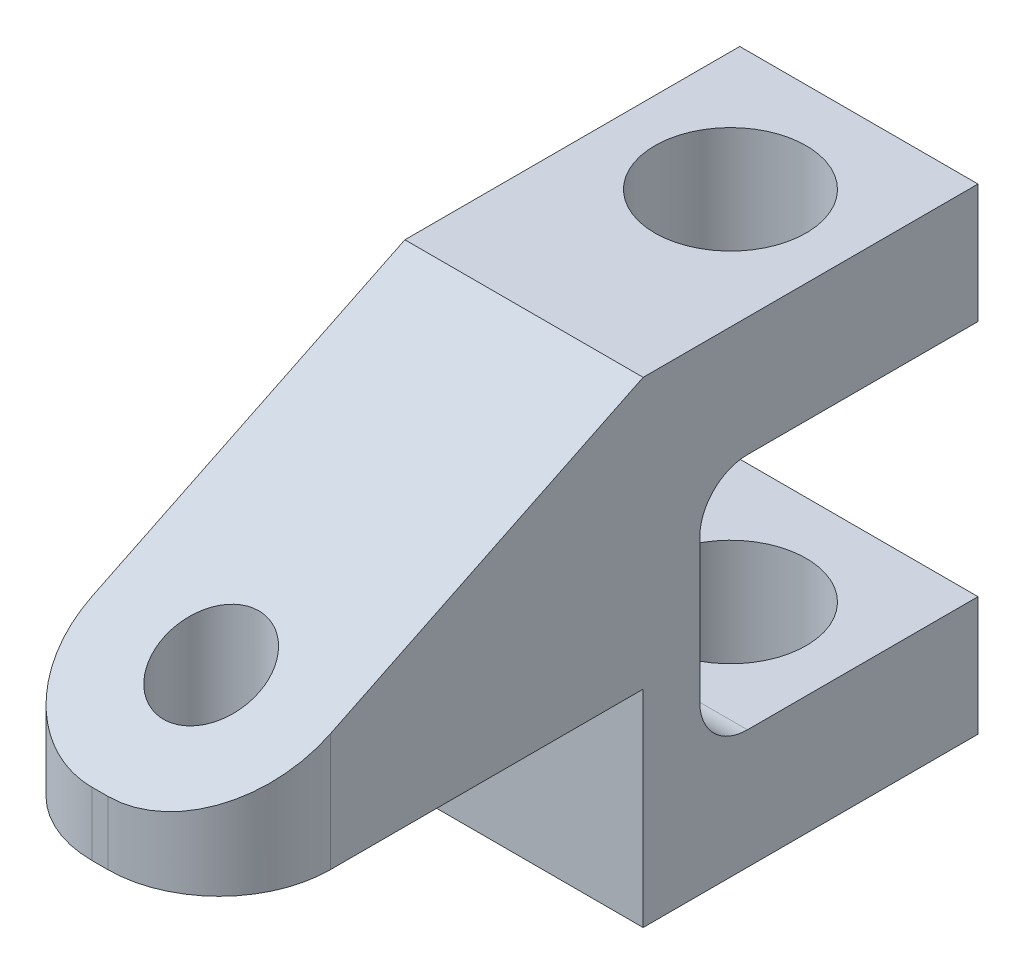
ISO-10303-21;
HEADER;
FILE_DESCRIPTION(('STEP AP214'),'2;1');
FILE_NAME('part.step','',(''),(''),'','','');
FILE_SCHEMA(('AUTOMOTIVE_DESIGN { 1 0 10303 214 1 1 1 1 }'));
ENDSEC;
DATA;
#1=APPLICATION_CONTEXT('core data for automotive mechanical design processes');
#2=APPLICATION_PROTOCOL_DEFINITION('international standard','automotive_design',2000,#1);
#3=PRODUCT_CONTEXT('',#1,'mechanical');
#4=PRODUCT('Part','Part','',(#3));
#5=PRODUCT_RELATED_PRODUCT_CATEGORY('part','',(#4));
#6=PRODUCT_DEFINITION_FORMATION('','',#4);
#7=PRODUCT_DEFINITION_CONTEXT('part definition',#1,'design');
#8=PRODUCT_DEFINITION('design','',#6,#7);
#9=PRODUCT_DEFINITION_SHAPE('','',#8);
#10=(LENGTH_UNIT() NAMED_UNIT(*) SI_UNIT(.MILLI.,.METRE.));
#11=(NAMED_UNIT(*) PLANE_ANGLE_UNIT() SI_UNIT($,.RADIAN.));
#12=(NAMED_UNIT(*) SI_UNIT($,.STERADIAN.) SOLID_ANGLE_UNIT());
#13=UNCERTAINTY_MEASURE_WITH_UNIT(LENGTH_MEASURE(1.E-05),#10,'distance_accuracy_value','');
#14=(GEOMETRIC_REPRESENTATION_CONTEXT(3) GLOBAL_UNCERTAINTY_ASSIGNED_CONTEXT((#13)) GLOBAL_UNIT_ASSIGNED_CONTEXT((#10,
#11,#12)) REPRESENTATION_CONTEXT('',''));
#15=CARTESIAN_POINT('',(0.,0.,0.));
#16=DIRECTION('',(0.,0.,1.));
#17=DIRECTION('',(1.,0.,0.));
#18=AXIS2_PLACEMENT_3D('',#15,#16,#17);
#19=CARTESIAN_POINT('',(-7.5,4.,-23.88888885));
#20=DIRECTION('',(0.,0.,1.));
#21=DIRECTION('',(1.,0.,0.));
#22=AXIS2_PLACEMENT_3D('',#19,#20,#21);
#23=PLANE('',#22);
#24=DIRECTION('',(0.,-1.,0.));
#25=VECTOR('',#24,1.);
#26=CARTESIAN_POINT('',(-7.5,4.,-23.88888885));
#27=LINE('',#26,#25);
#28=CARTESIAN_POINT('',(-7.5,-5.5,-23.88888885));
#29=VERTEX_POINT('',#28);
#30=CARTESIAN_POINT('',(-7.5,-13.,-23.88888885));
#31=VERTEX_POINT('',#30);
#32=EDGE_CURVE('E212',#29,#31,#27,.T.);
#33=ORIENTED_EDGE('',*,*,#32,.F.);
#34=DIRECTION('',(1.,0.,0.));
#35=VECTOR('',#34,1.);
#36=CARTESIAN_POINT('',(-7.5,-5.5,-23.88888885));
#37=LINE('',#36,#35);
#38=CARTESIAN_POINT('',(7.5,-5.5,-23.88888885));
#39=VERTEX_POINT('',#38);
#40=EDGE_CURVE('E172',#29,#39,#37,.T.);
#41=ORIENTED_EDGE('',*,*,#40,.T.);
#42=DIRECTION('',(0.,-1.,0.));
#43=VECTOR('',#42,1.);
#44=CARTESIAN_POINT('',(7.5,4.,-23.88888885));
#45=LINE('',#44,#43);
#46=CARTESIAN_POINT('',(7.5,-13.,-23.88888885));
#47=VERTEX_POINT('',#46);
#48=EDGE_CURVE('E225',#39,#47,#45,.T.);
#49=ORIENTED_EDGE('',*,*,#48,.T.);
#50=DIRECTION('',(-1.,0.,0.));
#51=VECTOR('',#50,1.);
#52=CARTESIAN_POINT('',(-7.5,-13.,-23.88888885));
#53=LINE('',#52,#51);
#54=EDGE_CURVE('E196',#47,#31,#53,.T.);
#55=ORIENTED_EDGE('',*,*,#54,.T.);
#56=EDGE_LOOP('',(#33,#41,#49,#55));
#57=FACE_BOUND('',#56,.T.);
#58=ADVANCED_FACE('F39',(#57),#23,.F.);
#59=CARTESIAN_POINT('',(7.5,4.,23.88888885));
#60=DIRECTION('',(-1.,0.,0.));
#61=DIRECTION('',(0.,0.,1.));
#62=AXIS2_PLACEMENT_3D('',#59,#60,#61);
#63=PLANE('',#62);
#64=DIRECTION('',(0.,-0.437821247110164,0.899062042118841));
#65=VECTOR('',#64,1.);
#66=CARTESIAN_POINT('',(7.5,17.,-2.80649568122188));
#67=LINE('',#66,#65);
#68=CARTESIAN_POINT('',(7.5,17.,-2.80649568122188));
#69=VERTEX_POINT('',#68);
#70=CARTESIAN_POINT('',(7.5,7.40882896418181,16.88888885));
#71=VERTEX_POINT('',#70);
#72=EDGE_CURVE('E156',#69,#71,#67,.T.);
#73=ORIENTED_EDGE('',*,*,#72,.T.);
#74=DIRECTION('',(0.,-1.,0.));
#75=VECTOR('',#74,1.);
#76=CARTESIAN_POINT('',(7.5,4.,16.88888885));
#77=LINE('',#76,#75);
#78=CARTESIAN_POINT('',(7.5,0.,16.88888885));
#79=VERTEX_POINT('',#78);
#80=EDGE_CURVE('E11',#71,#79,#77,.T.);
#81=ORIENTED_EDGE('',*,*,#80,.T.);
#82=DIRECTION('',(0.,0.,-1.));
#83=VECTOR('',#82,1.);
#84=CARTESIAN_POINT('',(7.5,0.,23.88888885));
#85=LINE('',#84,#83);
#86=CARTESIAN_POINT('',(7.5,0.,-2.80649568122187));
#87=VERTEX_POINT('',#86);
#88=EDGE_CURVE('E205',#79,#87,#85,.T.);
#89=ORIENTED_EDGE('',*,*,#88,.T.);
#90=DIRECTION('',(0.,1.,0.));
#91=VECTOR('',#90,1.);
#92=CARTESIAN_POINT('',(7.5,-13.,-2.80649568122188));
#93=LINE('',#92,#91);
#94=CARTESIAN_POINT('',(7.5,-13.,-2.80649568122188));
#95=VERTEX_POINT('',#94);
#96=EDGE_CURVE('E201',#95,#87,#93,.T.);
#97=ORIENTED_EDGE('',*,*,#96,.F.);
#98=DIRECTION('',(0.,0.,-1.));
#99=VECTOR('',#98,1.);
#100=CARTESIAN_POINT('',(7.5,-13.,-23.88888885));
#101=LINE('',#100,#99);
#102=EDGE_CURVE('E192',#95,#47,#101,.T.);
#103=ORIENTED_EDGE('',*,*,#102,.T.);
#104=ORIENTED_EDGE('',*,*,#48,.F.);
#105=DIRECTION('',(0.,0.,-1.));
#106=VECTOR('',#105,1.);
#107=CARTESIAN_POINT('',(7.5,-5.5,-23.88888885));
#108=LINE('',#107,#106);
#109=CARTESIAN_POINT('',(7.5,-5.5,-9.37209962189879));
#110=VERTEX_POINT('',#109);
#111=EDGE_CURVE('E347',#110,#39,#108,.T.);
#112=ORIENTED_EDGE('',*,*,#111,.F.);
#113=CARTESIAN_POINT('',(7.5,-2.5,-9.37209962189879));
#114=DIRECTION('',(-1.,0.,0.));
#115=DIRECTION('',(0.,0.,1.));
#116=AXIS2_PLACEMENT_3D('',#113,#114,#115);
#117=CIRCLE('',#116,3.);
#118=CARTESIAN_POINT('',(7.5,-2.5,-6.37209962189879));
#119=VERTEX_POINT('',#118);
#120=EDGE_CURVE('E254',#110,#119,#117,.T.);
#121=ORIENTED_EDGE('',*,*,#120,.T.);
#122=DIRECTION('',(0.,-1.,0.));
#123=VECTOR('',#122,1.);
#124=CARTESIAN_POINT('',(7.5,9.5,-6.37209962189879));
#125=LINE('',#124,#123);
#126=CARTESIAN_POINT('',(7.5,6.5,-6.37209962189879));
#127=VERTEX_POINT('',#126);
#128=EDGE_CURVE('E342',#127,#119,#125,.T.);
#129=ORIENTED_EDGE('',*,*,#128,.F.);
#130=CARTESIAN_POINT('',(7.5,6.5,-9.37209962189879));
#131=DIRECTION('',(-1.,0.,0.));
#132=DIRECTION('',(0.,0.,1.));
#133=AXIS2_PLACEMENT_3D('',#130,#131,#132);
#134=CIRCLE('',#133,3.);
#135=CARTESIAN_POINT('',(7.5,9.5,-9.37209962189879));
#136=VERTEX_POINT('',#135);
#137=EDGE_CURVE('E260',#127,#136,#134,.T.);
#138=ORIENTED_EDGE('',*,*,#137,.T.);
#139=DIRECTION('',(0.,0.,1.));
#140=VECTOR('',#139,1.);
#141=CARTESIAN_POINT('',(7.5,9.5,-23.88888885));
#142=LINE('',#141,#140);
#143=CARTESIAN_POINT('',(7.5,9.5,-23.88888885));
#144=VERTEX_POINT('',#143);
#145=EDGE_CURVE('E337',#144,#136,#142,.T.);
#146=ORIENTED_EDGE('',*,*,#145,.F.);
#147=CARTESIAN_POINT('',(7.5,17.,-23.88888885));
#148=VERTEX_POINT('',#147);
#149=EDGE_CURVE('E226',#148,#144,#45,.T.);
#150=ORIENTED_EDGE('',*,*,#149,.F.);
#151=DIRECTION('',(0.,0.,-1.));
#152=VECTOR('',#151,1.);
#153=CARTESIAN_POINT('',(7.5,17.,-23.88888885));
#154=LINE('',#153,#152);
#155=EDGE_CURVE('E165',#69,#148,#154,.T.);
#156=ORIENTED_EDGE('',*,*,#155,.F.);
#157=EDGE_LOOP('',(#73,#81,#89,#97,#103,#104,#112,#121,#129,#138,#146,#150,#156));
#158=FACE_BOUND('',#157,.T.);
#159=ADVANCED_FACE('F309',(#158),#63,.F.);
#160=ORIENTED_EDGE('',*,*,#149,.T.);
#161=DIRECTION('',(1.,0.,0.));
#162=VECTOR('',#161,1.);
#163=CARTESIAN_POINT('',(-7.5,9.5,-23.88888885));
#164=LINE('',#163,#162);
#165=CARTESIAN_POINT('',(-7.5,9.5,-23.88888885));
#166=VERTEX_POINT('',#165);
#167=EDGE_CURVE('E176',#166,#144,#164,.T.);
#168=ORIENTED_EDGE('',*,*,#167,.F.);
#169=CARTESIAN_POINT('',(-7.5,17.,-23.88888885));
#170=VERTEX_POINT('',#169);
#171=EDGE_CURVE('E222',#170,#166,#27,.T.);
#172=ORIENTED_EDGE('',*,*,#171,.F.);
#173=DIRECTION('',(-1.,0.,0.));
#174=VECTOR('',#173,1.);
#175=CARTESIAN_POINT('',(-7.5,17.,-23.88888885));
#176=LINE('',#175,#174);
#177=EDGE_CURVE('E170',#148,#170,#176,.T.);
#178=ORIENTED_EDGE('',*,*,#177,.F.);
#179=EDGE_LOOP('',(#160,#168,#172,#178));
#180=FACE_BOUND('',#179,.T.);
#181=ADVANCED_FACE('F322',(#180),#23,.F.);
#182=CARTESIAN_POINT('',(-7.5,4.,23.88888885));
#183=DIRECTION('',(1.,0.,0.));
#184=DIRECTION('',(0.,0.,-1.));
#185=AXIS2_PLACEMENT_3D('',#182,#183,#184);
#186=PLANE('',#185);
#187=DIRECTION('',(0.,0.,1.));
#188=VECTOR('',#187,1.);
#189=CARTESIAN_POINT('',(-7.5,0.,23.88888885));
#190=LINE('',#189,#188);
#191=CARTESIAN_POINT('',(-7.5,0.,-2.80649568122188));
#192=VERTEX_POINT('',#191);
#193=CARTESIAN_POINT('',(-7.5,0.,16.88888885));
#194=VERTEX_POINT('',#193);
#195=EDGE_CURVE('E216',#192,#194,#190,.T.);
#196=ORIENTED_EDGE('',*,*,#195,.T.);
#197=DIRECTION('',(0.,-1.,0.));
#198=VECTOR('',#197,1.);
#199=CARTESIAN_POINT('',(-7.5,4.,16.88888885));
#200=LINE('',#199,#198);
#201=CARTESIAN_POINT('',(-7.5,7.4088289641818,16.88888885));
#202=VERTEX_POINT('',#201);
#203=EDGE_CURVE('E63',#194,#202,#200,.F.);
#204=ORIENTED_EDGE('',*,*,#203,.T.);
#205=DIRECTION('',(0.,0.437821247110164,-0.899062042118841));
#206=VECTOR('',#205,1.);
#207=CARTESIAN_POINT('',(-7.5,17.,-2.80649568122188));
#208=LINE('',#207,#206);
#209=CARTESIAN_POINT('',(-7.5,17.,-2.80649568122188));
#210=VERTEX_POINT('',#209);
#211=EDGE_CURVE('E147',#202,#210,#208,.T.);
#212=ORIENTED_EDGE('',*,*,#211,.T.);
#213=DIRECTION('',(0.,0.,1.));
#214=VECTOR('',#213,1.);
#215=CARTESIAN_POINT('',(-7.5,17.,-23.88888885));
#216=LINE('',#215,#214);
#217=EDGE_CURVE('E152',#170,#210,#216,.T.);
#218=ORIENTED_EDGE('',*,*,#217,.F.);
#219=ORIENTED_EDGE('',*,*,#171,.T.);
#220=DIRECTION('',(0.,0.,1.));
#221=VECTOR('',#220,1.);
#222=CARTESIAN_POINT('',(-7.5,9.5,-23.88888885));
#223=LINE('',#222,#221);
#224=CARTESIAN_POINT('',(-7.5,9.5,-9.37209962189879));
#225=VERTEX_POINT('',#224);
#226=EDGE_CURVE('E356',#166,#225,#223,.T.);
#227=ORIENTED_EDGE('',*,*,#226,.T.);
#228=CARTESIAN_POINT('',(-7.5,6.5,-9.37209962189879));
#229=DIRECTION('',(1.,0.,0.));
#230=DIRECTION('',(0.,0.,-1.));
#231=AXIS2_PLACEMENT_3D('',#228,#229,#230);
#232=CIRCLE('',#231,3.);
#233=CARTESIAN_POINT('',(-7.5,6.5,-6.37209962189879));
#234=VERTEX_POINT('',#233);
#235=EDGE_CURVE('E263',#225,#234,#232,.T.);
#236=ORIENTED_EDGE('',*,*,#235,.T.);
#237=DIRECTION('',(0.,-1.,0.));
#238=VECTOR('',#237,1.);
#239=CARTESIAN_POINT('',(-7.5,9.5,-6.37209962189879));
#240=LINE('',#239,#238);
#241=CARTESIAN_POINT('',(-7.5,-2.5,-6.37209962189879));
#242=VERTEX_POINT('',#241);
#243=EDGE_CURVE('E361',#234,#242,#240,.T.);
#244=ORIENTED_EDGE('',*,*,#243,.T.);
#245=CARTESIAN_POINT('',(-7.5,-2.5,-9.37209962189879));
#246=DIRECTION('',(1.,0.,0.));
#247=DIRECTION('',(0.,0.,-1.));
#248=AXIS2_PLACEMENT_3D('',#245,#246,#247);
#249=CIRCLE('',#248,3.);
#250=CARTESIAN_POINT('',(-7.5,-5.5,-9.37209962189879));
#251=VERTEX_POINT('',#250);
#252=EDGE_CURVE('E257',#242,#251,#249,.T.);
#253=ORIENTED_EDGE('',*,*,#252,.T.);
#254=DIRECTION('',(0.,0.,-1.));
#255=VECTOR('',#254,1.);
#256=CARTESIAN_POINT('',(-7.5,-5.5,-23.88888885));
#257=LINE('',#256,#255);
#258=EDGE_CURVE('E352',#251,#29,#257,.T.);
#259=ORIENTED_EDGE('',*,*,#258,.T.);
#260=ORIENTED_EDGE('',*,*,#32,.T.);
#261=DIRECTION('',(0.,0.,1.));
#262=VECTOR('',#261,1.);
#263=CARTESIAN_POINT('',(-7.5,-13.,-23.88888885));
#264=LINE('',#263,#262);
#265=CARTESIAN_POINT('',(-7.5,-13.,-2.80649568122188));
#266=VERTEX_POINT('',#265);
#267=EDGE_CURVE('E184',#31,#266,#264,.T.);
#268=ORIENTED_EDGE('',*,*,#267,.T.);
#269=DIRECTION('',(0.,1.,0.));
#270=VECTOR('',#269,1.);
#271=CARTESIAN_POINT('',(-7.5,-13.,-2.80649568122188));
#272=LINE('',#271,#270);
#273=EDGE_CURVE('E200',#266,#192,#272,.T.);
#274=ORIENTED_EDGE('',*,*,#273,.T.);
#275=EDGE_LOOP('',(#196,#204,#212,#218,#219,#227,#236,#244,#253,#259,#260,#268,#274));
#276=FACE_BOUND('',#275,.T.);
#277=ADVANCED_FACE('F149',(#276),#186,.F.);
#278=CARTESIAN_POINT('',(-7.5,4.,23.88888885));
#279=DIRECTION('',(0.,0.,-1.));
#280=DIRECTION('',(-1.,0.,0.));
#281=AXIS2_PLACEMENT_3D('',#278,#279,#280);
#282=PLANE('',#281);
#283=DIRECTION('',(1.,0.,0.));
#284=VECTOR('',#283,1.);
#285=CARTESIAN_POINT('',(-7.5,4.,23.88888885));
#286=LINE('',#285,#284);
#287=CARTESIAN_POINT('',(-0.5,4.,23.88888885));
#288=VERTEX_POINT('',#287);
#289=CARTESIAN_POINT('',(0.5,4.,23.88888885));
#290=VERTEX_POINT('',#289);
#291=EDGE_CURVE('E209',#288,#290,#286,.T.);
#292=ORIENTED_EDGE('',*,*,#291,.F.);
#293=DIRECTION('',(0.,-1.,0.));
#294=VECTOR('',#293,1.);
#295=CARTESIAN_POINT('',(-0.5,4.,23.88888885));
#296=LINE('',#295,#294);
#297=CARTESIAN_POINT('',(-0.5,0.,23.88888885));
#298=VERTEX_POINT('',#297);
#299=EDGE_CURVE('E274',#288,#298,#296,.T.);
#300=ORIENTED_EDGE('',*,*,#299,.T.);
#301=DIRECTION('',(1.,0.,0.));
#302=VECTOR('',#301,1.);
#303=CARTESIAN_POINT('',(-7.5,0.,23.88888885));
#304=LINE('',#303,#302);
#305=CARTESIAN_POINT('',(0.5,0.,23.88888885));
#306=VERTEX_POINT('',#305);
#307=EDGE_CURVE('E213',#298,#306,#304,.T.);
#308=ORIENTED_EDGE('',*,*,#307,.T.);
#309=DIRECTION('',(0.,-1.,0.));
#310=VECTOR('',#309,1.);
#311=CARTESIAN_POINT('',(0.5,4.,23.88888885));
#312=LINE('',#311,#310);
#313=EDGE_CURVE('E266',#306,#290,#312,.F.);
#314=ORIENTED_EDGE('',*,*,#313,.T.);
#315=EDGE_LOOP('',(#292,#300,#308,#314));
#316=FACE_BOUND('',#315,.T.);
#317=ADVANCED_FACE('F292',(#316),#282,.F.);
#318=CARTESIAN_POINT('',(0.,0.,0.));
#319=DIRECTION('',(0.,-1.,0.));
#320=DIRECTION('',(0.,0.,-1.));
#321=AXIS2_PLACEMENT_3D('',#318,#319,#320);
#322=PLANE('',#321);
#323=CARTESIAN_POINT('',(0.,0.,16.88888885));
#324=DIRECTION('',(0.,-1.,0.));
#325=DIRECTION('',(0.,0.,-1.));
#326=AXIS2_PLACEMENT_3D('',#323,#324,#325);
#327=CIRCLE('',#326,3.);
#328=CARTESIAN_POINT('',(0.,0.,13.88888885));
#329=VERTEX_POINT('',#328);
#330=EDGE_CURVE('E271',#329,#329,#327,.T.);
#331=ORIENTED_EDGE('',*,*,#330,.F.);
#332=EDGE_LOOP('',(#331));
#333=FACE_BOUND('',#332,.T.);
#334=ORIENTED_EDGE('',*,*,#307,.F.);
#335=CARTESIAN_POINT('',(-0.5,0.,16.88888885));
#336=DIRECTION('',(0.,-1.,0.));
#337=DIRECTION('',(0.,0.,-1.));
#338=AXIS2_PLACEMENT_3D('',#335,#336,#337);
#339=CIRCLE('',#338,7.);
#340=EDGE_CURVE('E281',#298,#194,#339,.T.);
#341=ORIENTED_EDGE('',*,*,#340,.T.);
#342=ORIENTED_EDGE('',*,*,#195,.F.);
#343=DIRECTION('',(-1.,0.,0.));
#344=VECTOR('',#343,1.);
#345=CARTESIAN_POINT('',(0.,0.,-2.80649568122188));
#346=LINE('',#345,#344);
#347=EDGE_CURVE('E230',#87,#192,#346,.T.);
#348=ORIENTED_EDGE('',*,*,#347,.F.);
#349=ORIENTED_EDGE('',*,*,#88,.F.);
#350=CARTESIAN_POINT('',(0.5,0.,16.88888885));
#351=DIRECTION('',(0.,-1.,0.));
#352=DIRECTION('',(0.,0.,-1.));
#353=AXIS2_PLACEMENT_3D('',#350,#351,#352);
#354=CIRCLE('',#353,7.);
#355=EDGE_CURVE('E278',#79,#306,#354,.T.);
#356=ORIENTED_EDGE('',*,*,#355,.T.);
#357=EDGE_LOOP('',(#334,#341,#342,#348,#349,#356));
#358=FACE_BOUND('',#357,.T.);
#359=ADVANCED_FACE('F297',(#333,#358),#322,.T.);
#360=CARTESIAN_POINT('',(0.,-13.,0.));
#361=DIRECTION('',(0.,1.,0.));
#362=DIRECTION('',(0.,0.,1.));
#363=AXIS2_PLACEMENT_3D('',#360,#361,#362);
#364=PLANE('',#363);
#365=CARTESIAN_POINT('',(0.,-13.,-15.8064956812219));
#366=DIRECTION('',(0.,1.,0.));
#367=DIRECTION('',(0.,0.,1.));
#368=AXIS2_PLACEMENT_3D('',#365,#366,#367);
#369=CIRCLE('',#368,4.765);
#370=CARTESIAN_POINT('',(0.,-13.,-11.0414956812219));
#371=VERTEX_POINT('',#370);
#372=EDGE_CURVE('E240',#371,#371,#369,.T.);
#373=ORIENTED_EDGE('',*,*,#372,.T.);
#374=EDGE_LOOP('',(#373));
#375=FACE_BOUND('',#374,.T.);
#376=ORIENTED_EDGE('',*,*,#267,.F.);
#377=ORIENTED_EDGE('',*,*,#54,.F.);
#378=ORIENTED_EDGE('',*,*,#102,.F.);
#379=DIRECTION('',(1.,0.,0.));
#380=VECTOR('',#379,1.);
#381=CARTESIAN_POINT('',(-7.5,-13.,-2.80649568122188));
#382=LINE('',#381,#380);
#383=EDGE_CURVE('E188',#266,#95,#382,.T.);
#384=ORIENTED_EDGE('',*,*,#383,.F.);
#385=EDGE_LOOP('',(#376,#377,#378,#384));
#386=FACE_BOUND('',#385,.T.);
#387=ADVANCED_FACE('F305',(#375,#386),#364,.F.);
#388=CARTESIAN_POINT('',(-7.5,-13.,-2.80649568122188));
#389=DIRECTION('',(0.,0.,1.));
#390=DIRECTION('',(1.,0.,0.));
#391=AXIS2_PLACEMENT_3D('',#388,#389,#390);
#392=PLANE('',#391);
#393=ORIENTED_EDGE('',*,*,#96,.T.);
#394=ORIENTED_EDGE('',*,*,#347,.T.);
#395=ORIENTED_EDGE('',*,*,#273,.F.);
#396=ORIENTED_EDGE('',*,*,#383,.T.);
#397=EDGE_LOOP('',(#393,#394,#395,#396));
#398=FACE_BOUND('',#397,.T.);
#399=ADVANCED_FACE('F302',(#398),#392,.T.);
#400=CARTESIAN_POINT('',(0.,17.,0.));
#401=DIRECTION('',(0.,1.,0.));
#402=DIRECTION('',(0.,0.,1.));
#403=AXIS2_PLACEMENT_3D('',#400,#401,#402);
#404=PLANE('',#403);
#405=CARTESIAN_POINT('',(0.,17.,-15.8064956812219));
#406=DIRECTION('',(0.,1.,0.));
#407=DIRECTION('',(0.,0.,1.));
#408=AXIS2_PLACEMENT_3D('',#405,#406,#407);
#409=CIRCLE('',#408,4.765);
#410=CARTESIAN_POINT('',(0.,17.,-11.0414956812219));
#411=VERTEX_POINT('',#410);
#412=EDGE_CURVE('E155',#411,#411,#409,.T.);
#413=ORIENTED_EDGE('',*,*,#412,.F.);
#414=EDGE_LOOP('',(#413));
#415=FACE_BOUND('',#414,.T.);
#416=ORIENTED_EDGE('',*,*,#217,.T.);
#417=DIRECTION('',(1.,0.,0.));
#418=VECTOR('',#417,1.);
#419=CARTESIAN_POINT('',(-7.5,17.,-2.80649568122188));
#420=LINE('',#419,#418);
#421=EDGE_CURVE('E159',#210,#69,#420,.T.);
#422=ORIENTED_EDGE('',*,*,#421,.T.);
#423=ORIENTED_EDGE('',*,*,#155,.T.);
#424=ORIENTED_EDGE('',*,*,#177,.T.);
#425=EDGE_LOOP('',(#416,#422,#423,#424));
#426=FACE_BOUND('',#425,.T.);
#427=ADVANCED_FACE('F168',(#415,#426),#404,.T.);
#428=CARTESIAN_POINT('',(-7.5,-5.5,-23.88888885));
#429=DIRECTION('',(0.,-1.,0.));
#430=DIRECTION('',(0.,0.,-1.));
#431=AXIS2_PLACEMENT_3D('',#428,#429,#430);
#432=PLANE('',#431);
#433=CARTESIAN_POINT('',(0.,-5.5,-15.8064956812219));
#434=DIRECTION('',(0.,-1.,0.));
#435=DIRECTION('',(0.,0.,-1.));
#436=AXIS2_PLACEMENT_3D('',#433,#434,#435);
#437=CIRCLE('',#436,4.765);
#438=CARTESIAN_POINT('',(0.,-5.5,-11.0414956812219));
#439=VERTEX_POINT('',#438);
#440=EDGE_CURVE('E239',#439,#439,#437,.T.);
#441=ORIENTED_EDGE('',*,*,#440,.T.);
#442=EDGE_LOOP('',(#441));
#443=FACE_BOUND('',#442,.T.);
#444=ORIENTED_EDGE('',*,*,#258,.F.);
#445=DIRECTION('',(1.,0.,0.));
#446=VECTOR('',#445,1.);
#447=CARTESIAN_POINT('',(7.5,-5.5,-9.37209962189879));
#448=LINE('',#447,#446);
#449=EDGE_CURVE('E234',#251,#110,#448,.T.);
#450=ORIENTED_EDGE('',*,*,#449,.T.);
#451=ORIENTED_EDGE('',*,*,#111,.T.);
#452=ORIENTED_EDGE('',*,*,#40,.F.);
#453=EDGE_LOOP('',(#444,#450,#451,#452));
#454=FACE_BOUND('',#453,.T.);
#455=ADVANCED_FACE('F395',(#443,#454),#432,.F.);
#456=CARTESIAN_POINT('',(-7.5,9.5,-6.37209962189879));
#457=DIRECTION('',(0.,0.,1.));
#458=DIRECTION('',(0.,-1.,0.));
#459=AXIS2_PLACEMENT_3D('',#456,#457,#458);
#460=PLANE('',#459);
#461=ORIENTED_EDGE('',*,*,#128,.T.);
#462=DIRECTION('',(1.,0.,0.));
#463=VECTOR('',#462,1.);
#464=CARTESIAN_POINT('',(-7.5,-2.5,-6.37209962189879));
#465=LINE('',#464,#463);
#466=EDGE_CURVE('E248',#119,#242,#465,.F.);
#467=ORIENTED_EDGE('',*,*,#466,.T.);
#468=ORIENTED_EDGE('',*,*,#243,.F.);
#469=DIRECTION('',(1.,0.,0.));
#470=VECTOR('',#469,1.);
#471=CARTESIAN_POINT('',(7.5,6.5,-6.37209962189879));
#472=LINE('',#471,#470);
#473=EDGE_CURVE('E244',#234,#127,#472,.T.);
#474=ORIENTED_EDGE('',*,*,#473,.T.);
#475=EDGE_LOOP('',(#461,#467,#468,#474));
#476=FACE_BOUND('',#475,.T.);
#477=ADVANCED_FACE('F401',(#476),#460,.F.);
#478=CARTESIAN_POINT('',(-7.5,9.5,-23.88888885));
#479=DIRECTION('',(0.,1.,0.));
#480=DIRECTION('',(0.,0.,1.));
#481=AXIS2_PLACEMENT_3D('',#478,#479,#480);
#482=PLANE('',#481);
#483=CARTESIAN_POINT('',(0.,9.5,-15.8064956812219));
#484=DIRECTION('',(0.,1.,0.));
#485=DIRECTION('',(0.,0.,1.));
#486=AXIS2_PLACEMENT_3D('',#483,#484,#485);
#487=CIRCLE('',#486,4.765);
#488=CARTESIAN_POINT('',(0.,9.5,-11.0414956812219));
#489=VERTEX_POINT('',#488);
#490=EDGE_CURVE('E235',#489,#489,#487,.T.);
#491=ORIENTED_EDGE('',*,*,#490,.T.);
#492=EDGE_LOOP('',(#491));
#493=FACE_BOUND('',#492,.T.);
#494=ORIENTED_EDGE('',*,*,#145,.T.);
#495=DIRECTION('',(1.,0.,0.));
#496=VECTOR('',#495,1.);
#497=CARTESIAN_POINT('',(-7.5,9.5,-9.37209962189879));
#498=LINE('',#497,#496);
#499=EDGE_CURVE('E251',#136,#225,#498,.F.);
#500=ORIENTED_EDGE('',*,*,#499,.T.);
#501=ORIENTED_EDGE('',*,*,#226,.F.);
#502=ORIENTED_EDGE('',*,*,#167,.T.);
#503=EDGE_LOOP('',(#494,#500,#501,#502));
#504=FACE_BOUND('',#503,.T.);
#505=ADVANCED_FACE('F397',(#493,#504),#482,.F.);
#506=CARTESIAN_POINT('',(0.,-13.,-15.8064956812219));
#507=DIRECTION('',(0.,1.,0.));
#508=DIRECTION('',(0.,0.,1.));
#509=AXIS2_PLACEMENT_3D('',#506,#507,#508);
#510=CYLINDRICAL_SURFACE('',#509,4.765);
#511=CARTESIAN_POINT('',(0.,17.,-11.0414956812219));
#512=CARTESIAN_POINT('',(0.,16.921875,-11.0414956812219));
#513=CARTESIAN_POINT('',(0.,16.84375,-11.0414956812219));
#514=CARTESIAN_POINT('',(0.,16.6875,-11.0414956812219));
#515=CARTESIAN_POINT('',(0.,16.609375,-11.0414956812219));
#516=CARTESIAN_POINT('',(0.,16.453125,-11.0414956812219));
#517=CARTESIAN_POINT('',(0.,16.375,-11.0414956812219));
#518=CARTESIAN_POINT('',(0.,16.21875,-11.0414956812219));
#519=CARTESIAN_POINT('',(0.,16.140625,-11.0414956812219));
#520=CARTESIAN_POINT('',(0.,15.984375,-11.0414956812219));
#521=CARTESIAN_POINT('',(0.,15.90625,-11.0414956812219));
#522=CARTESIAN_POINT('',(0.,15.75,-11.0414956812219));
#523=CARTESIAN_POINT('',(0.,15.671875,-11.0414956812219));
#524=CARTESIAN_POINT('',(0.,15.515625,-11.0414956812219));
#525=CARTESIAN_POINT('',(0.,15.4375,-11.0414956812219));
#526=CARTESIAN_POINT('',(0.,15.28125,-11.0414956812219));
#527=CARTESIAN_POINT('',(0.,15.203125,-11.0414956812219));
#528=CARTESIAN_POINT('',(0.,15.046875,-11.0414956812219));
#529=CARTESIAN_POINT('',(0.,14.96875,-11.0414956812219));
#530=CARTESIAN_POINT('',(0.,14.8125,-11.0414956812219));
#531=CARTESIAN_POINT('',(0.,14.734375,-11.0414956812219));
#532=CARTESIAN_POINT('',(0.,14.578125,-11.0414956812219));
#533=CARTESIAN_POINT('',(0.,14.5,-11.0414956812219));
#534=CARTESIAN_POINT('',(0.,14.34375,-11.0414956812219));
#535=CARTESIAN_POINT('',(0.,14.265625,-11.0414956812219));
#536=CARTESIAN_POINT('',(0.,14.109375,-11.0414956812219));
#537=CARTESIAN_POINT('',(0.,14.03125,-11.0414956812219));
#538=CARTESIAN_POINT('',(0.,13.875,-11.0414956812219));
#539=CARTESIAN_POINT('',(0.,13.796875,-11.0414956812219));
#540=CARTESIAN_POINT('',(0.,13.640625,-11.0414956812219));
#541=CARTESIAN_POINT('',(0.,13.5625,-11.0414956812219));
#542=CARTESIAN_POINT('',(0.,13.40625,-11.0414956812219));
#543=CARTESIAN_POINT('',(0.,13.328125,-11.0414956812219));
#544=CARTESIAN_POINT('',(0.,13.171875,-11.0414956812219));
#545=CARTESIAN_POINT('',(0.,13.09375,-11.0414956812219));
#546=CARTESIAN_POINT('',(0.,12.9375,-11.0414956812219));
#547=CARTESIAN_POINT('',(0.,12.859375,-11.0414956812219));
#548=CARTESIAN_POINT('',(0.,12.703125,-11.0414956812219));
#549=CARTESIAN_POINT('',(0.,12.625,-11.0414956812219));
#550=CARTESIAN_POINT('',(0.,12.46875,-11.0414956812219));
#551=CARTESIAN_POINT('',(0.,12.390625,-11.0414956812219));
#552=CARTESIAN_POINT('',(0.,12.234375,-11.0414956812219));
#553=CARTESIAN_POINT('',(0.,12.15625,-11.0414956812219));
#554=CARTESIAN_POINT('',(0.,12.,-11.0414956812219));
#555=CARTESIAN_POINT('',(0.,11.921875,-11.0414956812219));
#556=CARTESIAN_POINT('',(0.,11.765625,-11.0414956812219));
#557=CARTESIAN_POINT('',(0.,11.6875,-11.0414956812219));
#558=CARTESIAN_POINT('',(0.,11.53125,-11.0414956812219));
#559=CARTESIAN_POINT('',(0.,11.453125,-11.0414956812219));
#560=CARTESIAN_POINT('',(0.,11.296875,-11.0414956812219));
#561=CARTESIAN_POINT('',(0.,11.21875,-11.0414956812219));
#562=CARTESIAN_POINT('',(0.,11.0625,-11.0414956812219));
#563=CARTESIAN_POINT('',(0.,10.984375,-11.0414956812219));
#564=CARTESIAN_POINT('',(0.,10.828125,-11.0414956812219));
#565=CARTESIAN_POINT('',(0.,10.75,-11.0414956812219));
#566=CARTESIAN_POINT('',(0.,10.59375,-11.0414956812219));
#567=CARTESIAN_POINT('',(0.,10.515625,-11.0414956812219));
#568=CARTESIAN_POINT('',(0.,10.359375,-11.0414956812219));
#569=CARTESIAN_POINT('',(0.,10.28125,-11.0414956812219));
#570=CARTESIAN_POINT('',(0.,10.125,-11.0414956812219));
#571=CARTESIAN_POINT('',(0.,10.046875,-11.0414956812219));
#572=CARTESIAN_POINT('',(0.,9.890625,-11.0414956812219));
#573=CARTESIAN_POINT('',(0.,9.8125,-11.0414956812219));
#574=CARTESIAN_POINT('',(0.,9.65625,-11.0414956812219));
#575=CARTESIAN_POINT('',(0.,9.578125,-11.0414956812219));
#576=CARTESIAN_POINT('',(0.,9.5,-11.0414956812219));
#577=B_SPLINE_CURVE_WITH_KNOTS('',3,(#511,#512,#513,#514,#515,#516,#517,#518,#519,#520,#521,
#522,#523,#524,#525,#526,#527,#528,#529,#530,#531,#532,#533,#534,#535,#536,#537,#538,#539,#540,
#541,#542,#543,#544,#545,#546,#547,#548,#549,#550,#551,#552,#553,#554,#555,#556,#557,#558,#559,
#560,#561,#562,#563,#564,#565,#566,#567,#568,#569,#570,#571,#572,#573,#574,#575,#576),
.UNSPECIFIED.,.F.,.F.,(4,2,2,2,2,2,2,2,2,2,2,2,2,2,2,2,2,2,2,2,2,2,2,2,2,2,2,2,2,2,2,2,4),(0.,
0.234374999999998,0.46875,0.703124999999999,0.937500000000001,1.171875,1.40625,1.640625,1.875,
2.109375,2.34375,2.578125,2.8125,3.046875,3.28125,3.515625,3.75,3.984375,4.21875,4.453125,
4.6875,4.921875,5.15625,5.390625,5.625,5.859375,6.09375,6.328125,6.5625,6.796875,7.03125,
7.265625,7.5),.UNSPECIFIED.);
#578=EDGE_CURVE('BSEAM400',#411,#489,#577,.T.);
#579=ORIENTED_EDGE('',*,*,#412,.T.);
#580=ORIENTED_EDGE('',*,*,#490,.F.);
#581=ORIENTED_EDGE('',*,*,#578,.T.);
#582=ORIENTED_EDGE('',*,*,#578,.F.);
#583=EDGE_LOOP('',(#579,#581,#580,#582));
#584=FACE_BOUND('',#583,.T.);
#585=ADVANCED_FACE('F400',(#584),#510,.F.);
#586=CARTESIAN_POINT('',(0.,-13.,-11.0414956812219));
#587=CARTESIAN_POINT('',(0.,-12.921875,-11.0414956812219));
#588=CARTESIAN_POINT('',(0.,-12.84375,-11.0414956812219));
#589=CARTESIAN_POINT('',(0.,-12.6875,-11.0414956812219));
#590=CARTESIAN_POINT('',(0.,-12.609375,-11.0414956812219));
#591=CARTESIAN_POINT('',(0.,-12.453125,-11.0414956812219));
#592=CARTESIAN_POINT('',(0.,-12.375,-11.0414956812219));
#593=CARTESIAN_POINT('',(0.,-12.21875,-11.0414956812219));
#594=CARTESIAN_POINT('',(0.,-12.140625,-11.0414956812219));
#595=CARTESIAN_POINT('',(0.,-11.984375,-11.0414956812219));
#596=CARTESIAN_POINT('',(0.,-11.90625,-11.0414956812219));
#597=CARTESIAN_POINT('',(0.,-11.75,-11.0414956812219));
#598=CARTESIAN_POINT('',(0.,-11.671875,-11.0414956812219));
#599=CARTESIAN_POINT('',(0.,-11.515625,-11.0414956812219));
#600=CARTESIAN_POINT('',(0.,-11.4375,-11.0414956812219));
#601=CARTESIAN_POINT('',(0.,-11.28125,-11.0414956812219));
#602=CARTESIAN_POINT('',(0.,-11.203125,-11.0414956812219));
#603=CARTESIAN_POINT('',(0.,-11.046875,-11.0414956812219));
#604=CARTESIAN_POINT('',(0.,-10.96875,-11.0414956812219));
#605=CARTESIAN_POINT('',(0.,-10.8125,-11.0414956812219));
#606=CARTESIAN_POINT('',(0.,-10.734375,-11.0414956812219));
#607=CARTESIAN_POINT('',(0.,-10.578125,-11.0414956812219));
#608=CARTESIAN_POINT('',(0.,-10.5,-11.0414956812219));
#609=CARTESIAN_POINT('',(0.,-10.34375,-11.0414956812219));
#610=CARTESIAN_POINT('',(0.,-10.265625,-11.0414956812219));
#611=CARTESIAN_POINT('',(0.,-10.109375,-11.0414956812219));
#612=CARTESIAN_POINT('',(0.,-10.03125,-11.0414956812219));
#613=CARTESIAN_POINT('',(0.,-9.875,-11.0414956812219));
#614=CARTESIAN_POINT('',(0.,-9.796875,-11.0414956812219));
#615=CARTESIAN_POINT('',(0.,-9.640625,-11.0414956812219));
#616=CARTESIAN_POINT('',(0.,-9.5625,-11.0414956812219));
#617=CARTESIAN_POINT('',(0.,-9.40625,-11.0414956812219));
#618=CARTESIAN_POINT('',(0.,-9.328125,-11.0414956812219));
#619=CARTESIAN_POINT('',(0.,-9.171875,-11.0414956812219));
#620=CARTESIAN_POINT('',(0.,-9.09375,-11.0414956812219));
#621=CARTESIAN_POINT('',(0.,-8.9375,-11.0414956812219));
#622=CARTESIAN_POINT('',(0.,-8.859375,-11.0414956812219));
#623=CARTESIAN_POINT('',(0.,-8.703125,-11.0414956812219));
#624=CARTESIAN_POINT('',(0.,-8.625,-11.0414956812219));
#625=CARTESIAN_POINT('',(0.,-8.46875,-11.0414956812219));
#626=CARTESIAN_POINT('',(0.,-8.390625,-11.0414956812219));
#627=CARTESIAN_POINT('',(0.,-8.234375,-11.0414956812219));
#628=CARTESIAN_POINT('',(0.,-8.15625,-11.0414956812219));
#629=CARTESIAN_POINT('',(0.,-8.,-11.0414956812219));
#630=CARTESIAN_POINT('',(0.,-7.921875,-11.0414956812219));
#631=CARTESIAN_POINT('',(0.,-7.765625,-11.0414956812219));
#632=CARTESIAN_POINT('',(0.,-7.6875,-11.0414956812219));
#633=CARTESIAN_POINT('',(0.,-7.53125,-11.0414956812219));
#634=CARTESIAN_POINT('',(0.,-7.453125,-11.0414956812219));
#635=CARTESIAN_POINT('',(0.,-7.296875,-11.0414956812219));
#636=CARTESIAN_POINT('',(0.,-7.21875,-11.0414956812219));
#637=CARTESIAN_POINT('',(0.,-7.0625,-11.0414956812219));
#638=CARTESIAN_POINT('',(0.,-6.984375,-11.0414956812219));
#639=CARTESIAN_POINT('',(0.,-6.828125,-11.0414956812219));
#640=CARTESIAN_POINT('',(0.,-6.75,-11.0414956812219));
#641=CARTESIAN_POINT('',(0.,-6.59375,-11.0414956812219));
#642=CARTESIAN_POINT('',(0.,-6.515625,-11.0414956812219));
#643=CARTESIAN_POINT('',(0.,-6.359375,-11.0414956812219));
#644=CARTESIAN_POINT('',(0.,-6.28125,-11.0414956812219));
#645=CARTESIAN_POINT('',(0.,-6.125,-11.0414956812219));
#646=CARTESIAN_POINT('',(0.,-6.046875,-11.0414956812219));
#647=CARTESIAN_POINT('',(0.,-5.890625,-11.0414956812219));
#648=CARTESIAN_POINT('',(0.,-5.8125,-11.0414956812219));
#649=CARTESIAN_POINT('',(0.,-5.65625,-11.0414956812219));
#650=CARTESIAN_POINT('',(0.,-5.578125,-11.0414956812219));
#651=CARTESIAN_POINT('',(0.,-5.5,-11.0414956812219));
#652=B_SPLINE_CURVE_WITH_KNOTS('',3,(#586,#587,#588,#589,#590,#591,#592,#593,#594,#595,#596,
#597,#598,#599,#600,#601,#602,#603,#604,#605,#606,#607,#608,#609,#610,#611,#612,#613,#614,#615,
#616,#617,#618,#619,#620,#621,#622,#623,#624,#625,#626,#627,#628,#629,#630,#631,#632,#633,#634,
#635,#636,#637,#638,#639,#640,#641,#642,#643,#644,#645,#646,#647,#648,#649,#650,#651),
.UNSPECIFIED.,.F.,.F.,(4,2,2,2,2,2,2,2,2,2,2,2,2,2,2,2,2,2,2,2,2,2,2,2,2,2,2,2,2,2,2,2,4),(0.,
0.234375,0.46875,0.703125000000001,0.937500000000001,1.171875,1.40625,1.640625,1.875,2.109375,
2.34375,2.578125,2.8125,3.046875,3.28125,3.515625,3.75,3.984375,4.21875,4.453125,4.6875,
4.921875,5.15625,5.390625,5.625,5.859375,6.09375,6.328125,6.56250000000001,6.79687500000001,
7.03125000000001,7.26562500000001,7.50000000000001),.UNSPECIFIED.);
#653=EDGE_CURVE('BSEAM409',#371,#439,#652,.T.);
#654=ORIENTED_EDGE('',*,*,#372,.F.);
#655=ORIENTED_EDGE('',*,*,#440,.F.);
#656=ORIENTED_EDGE('',*,*,#653,.T.);
#657=ORIENTED_EDGE('',*,*,#653,.F.);
#658=EDGE_LOOP('',(#654,#656,#655,#657));
#659=FACE_BOUND('',#658,.T.);
#660=ADVANCED_FACE('F409',(#659),#510,.F.);
#661=CARTESIAN_POINT('',(-7.5,-2.5,-9.37209962189879));
#662=DIRECTION('',(-1.,0.,0.));
#663=DIRECTION('',(0.,0.,1.));
#664=AXIS2_PLACEMENT_3D('',#661,#662,#663);
#665=CYLINDRICAL_SURFACE('',#664,3.);
#666=ORIENTED_EDGE('',*,*,#252,.F.);
#667=ORIENTED_EDGE('',*,*,#466,.F.);
#668=ORIENTED_EDGE('',*,*,#120,.F.);
#669=ORIENTED_EDGE('',*,*,#449,.F.);
#670=EDGE_LOOP('',(#666,#667,#668,#669));
#671=FACE_BOUND('',#670,.T.);
#672=ADVANCED_FACE('F412',(#671),#665,.F.);
#673=CARTESIAN_POINT('',(-7.5,6.5,-9.37209962189879));
#674=DIRECTION('',(-1.,0.,0.));
#675=DIRECTION('',(0.,0.,1.));
#676=AXIS2_PLACEMENT_3D('',#673,#674,#675);
#677=CYLINDRICAL_SURFACE('',#676,3.);
#678=ORIENTED_EDGE('',*,*,#235,.F.);
#679=ORIENTED_EDGE('',*,*,#499,.F.);
#680=ORIENTED_EDGE('',*,*,#137,.F.);
#681=ORIENTED_EDGE('',*,*,#473,.F.);
#682=EDGE_LOOP('',(#678,#679,#680,#681));
#683=FACE_BOUND('',#682,.T.);
#684=ADVANCED_FACE('F416',(#683),#677,.F.);
#685=CARTESIAN_POINT('',(-37.1924831442202,17.,-2.80649568122188));
#686=DIRECTION('',(0.,0.899062042118841,0.437821247110164));
#687=DIRECTION('',(0.,-0.437821247110164,0.899062042118841));
#688=AXIS2_PLACEMENT_3D('',#685,#686,#687);
#689=PLANE('',#688);
#690=CARTESIAN_POINT('',(0.,7.4088289641818,16.88888885));
#691=DIRECTION('',(0.,0.899062042118841,0.437821247110164));
#692=DIRECTION('',(0.,0.437821247110164,-0.899062042118841));
#693=AXIS2_PLACEMENT_3D('',#690,#691,#692);
#694=ELLIPSE('',#693,3.33681087562081,3.);
#695=CARTESIAN_POINT('',(0.,8.86975566311686,13.88888885));
#696=VERTEX_POINT('',#695);
#697=EDGE_CURVE('E267',#696,#696,#694,.T.);
#698=ORIENTED_EDGE('',*,*,#697,.F.);
#699=EDGE_LOOP('',(#698));
#700=FACE_BOUND('',#699,.T.);
#701=ORIENTED_EDGE('',*,*,#211,.F.);
#702=CARTESIAN_POINT('',(-0.5,7.4088289641818,16.88888885));
#703=DIRECTION('',(0.,0.899062042118841,0.437821247110164));
#704=DIRECTION('',(0.,-0.437821247110164,0.899062042118841));
#705=AXIS2_PLACEMENT_3D('',#702,#703,#704);
#706=ELLIPSE('',#705,7.78589204311521,7.);
#707=EDGE_CURVE('E48',#202,#288,#706,.T.);
#708=ORIENTED_EDGE('',*,*,#707,.T.);
#709=ORIENTED_EDGE('',*,*,#291,.T.);
#710=CARTESIAN_POINT('',(0.5,7.4088289641818,16.88888885));
#711=DIRECTION('',(0.,0.899062042118841,0.437821247110164));
#712=DIRECTION('',(0.,-0.437821247110164,0.899062042118841));
#713=AXIS2_PLACEMENT_3D('',#710,#711,#712);
#714=ELLIPSE('',#713,7.78589204311521,7.);
#715=EDGE_CURVE('E55',#290,#71,#714,.T.);
#716=ORIENTED_EDGE('',*,*,#715,.T.);
#717=ORIENTED_EDGE('',*,*,#72,.F.);
#718=ORIENTED_EDGE('',*,*,#421,.F.);
#719=EDGE_LOOP('',(#701,#708,#709,#716,#717,#718));
#720=FACE_BOUND('',#719,.T.);
#721=ADVANCED_FACE('F160',(#700,#720),#689,.T.);
#722=CARTESIAN_POINT('',(0.,-13.,16.88888885));
#723=DIRECTION('',(0.,1.,0.));
#724=DIRECTION('',(0.,0.,1.));
#725=AXIS2_PLACEMENT_3D('',#722,#723,#724);
#726=CYLINDRICAL_SURFACE('',#725,3.);
#727=ORIENTED_EDGE('',*,*,#330,.T.);
#728=EDGE_LOOP('',(#727));
#729=FACE_BOUND('',#728,.T.);
#730=ORIENTED_EDGE('',*,*,#697,.T.);
#731=EDGE_LOOP('',(#730));
#732=FACE_BOUND('',#731,.T.);
#733=ADVANCED_FACE('F318',(#729,#732),#726,.F.);
#734=CARTESIAN_POINT('',(-0.5,4.,16.88888885));
#735=DIRECTION('',(0.,-1.,0.));
#736=DIRECTION('',(0.,0.,-1.));
#737=AXIS2_PLACEMENT_3D('',#734,#735,#736);
#738=CYLINDRICAL_SURFACE('',#737,7.);
#739=ORIENTED_EDGE('',*,*,#707,.F.);
#740=ORIENTED_EDGE('',*,*,#203,.F.);
#741=ORIENTED_EDGE('',*,*,#340,.F.);
#742=ORIENTED_EDGE('',*,*,#299,.F.);
#743=EDGE_LOOP('',(#739,#740,#741,#742));
#744=FACE_BOUND('',#743,.T.);
#745=ADVANCED_FACE('F295',(#744),#738,.T.);
#746=CARTESIAN_POINT('',(0.5,4.,16.88888885));
#747=DIRECTION('',(0.,-1.,0.));
#748=DIRECTION('',(0.,0.,-1.));
#749=AXIS2_PLACEMENT_3D('',#746,#747,#748);
#750=CYLINDRICAL_SURFACE('',#749,7.);
#751=ORIENTED_EDGE('',*,*,#715,.F.);
#752=ORIENTED_EDGE('',*,*,#313,.F.);
#753=ORIENTED_EDGE('',*,*,#355,.F.);
#754=ORIENTED_EDGE('',*,*,#80,.F.);
#755=EDGE_LOOP('',(#751,#752,#753,#754));
#756=FACE_BOUND('',#755,.T.);
#757=ADVANCED_FACE('F41',(#756),#750,.T.);
#758=CLOSED_SHELL('',(#58,#159,#181,#277,#317,#359,#387,#399,#427,#455,#477,#505,#585,#660,#672,
#684,#721,#733,#745,#757));
#759=MANIFOLD_SOLID_BREP('B2',#758);
#760=ADVANCED_BREP_SHAPE_REPRESENTATION('',(#18,#759),#14);
#761=SHAPE_DEFINITION_REPRESENTATION(#9,#760);
ENDSEC;
END-ISO-10303-21;
